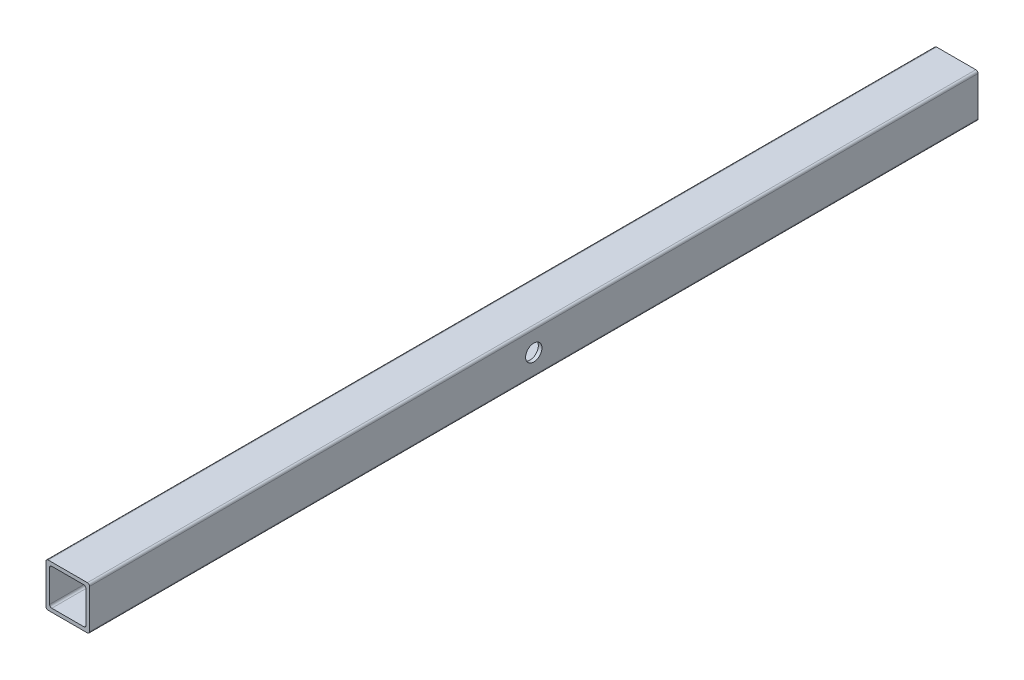
ISO-10303-21;
HEADER;
FILE_DESCRIPTION(('STEP AP214'),'2;1');
FILE_NAME('part.step','',(''),(''),'','','');
FILE_SCHEMA(('AUTOMOTIVE_DESIGN { 1 0 10303 214 1 1 1 1 }'));
ENDSEC;
DATA;
#1=APPLICATION_CONTEXT('core data for automotive mechanical design processes');
#2=APPLICATION_PROTOCOL_DEFINITION('international standard','automotive_design',2000,#1);
#3=PRODUCT_CONTEXT('',#1,'mechanical');
#4=PRODUCT('Part','Part','',(#3));
#5=PRODUCT_RELATED_PRODUCT_CATEGORY('part','',(#4));
#6=PRODUCT_DEFINITION_FORMATION('','',#4);
#7=PRODUCT_DEFINITION_CONTEXT('part definition',#1,'design');
#8=PRODUCT_DEFINITION('design','',#6,#7);
#9=PRODUCT_DEFINITION_SHAPE('','',#8);
#10=(LENGTH_UNIT() NAMED_UNIT(*) SI_UNIT(.MILLI.,.METRE.));
#11=(NAMED_UNIT(*) PLANE_ANGLE_UNIT() SI_UNIT($,.RADIAN.));
#12=(NAMED_UNIT(*) SI_UNIT($,.STERADIAN.) SOLID_ANGLE_UNIT());
#13=UNCERTAINTY_MEASURE_WITH_UNIT(LENGTH_MEASURE(1.E-05),#10,'distance_accuracy_value','');
#14=(GEOMETRIC_REPRESENTATION_CONTEXT(3) GLOBAL_UNCERTAINTY_ASSIGNED_CONTEXT((#13)) GLOBAL_UNIT_ASSIGNED_CONTEXT((#10,
#11,#12)) REPRESENTATION_CONTEXT('',''));
#15=CARTESIAN_POINT('',(0.,0.,0.));
#16=DIRECTION('',(0.,0.,1.));
#17=DIRECTION('',(1.,0.,0.));
#18=AXIS2_PLACEMENT_3D('',#15,#16,#17);
#19=CARTESIAN_POINT('',(22.0218,-0.8382,518.16));
#20=DIRECTION('',(0.,0.,1.));
#21=DIRECTION('',(1.,0.,0.));
#22=AXIS2_PLACEMENT_3D('',#19,#20,#21);
#23=PLANE('',#22);
#24=CARTESIAN_POINT('',(22.0218,-0.8382,518.16));
#25=DIRECTION('',(0.,0.,1.));
#26=DIRECTION('',(1.,0.,0.));
#27=AXIS2_PLACEMENT_3D('',#24,#25,#26);
#28=CIRCLE('',#27,1.27);
#29=CARTESIAN_POINT('',(22.0218,-2.1082,518.16));
#30=VERTEX_POINT('',#29);
#31=CARTESIAN_POINT('',(23.2918,-0.838199999999991,518.16));
#32=VERTEX_POINT('',#31);
#33=EDGE_CURVE('E222',#30,#32,#28,.T.);
#34=ORIENTED_EDGE('',*,*,#33,.T.);
#35=DIRECTION('',(0.,1.,0.));
#36=VECTOR('',#35,1.);
#37=CARTESIAN_POINT('',(23.2918,22.0218,518.16));
#38=LINE('',#37,#36);
#39=CARTESIAN_POINT('',(23.2918,22.0218,518.16));
#40=VERTEX_POINT('',#39);
#41=EDGE_CURVE('E225',#32,#40,#38,.T.);
#42=ORIENTED_EDGE('',*,*,#41,.T.);
#43=CARTESIAN_POINT('',(22.0218,22.0218,518.16));
#44=DIRECTION('',(0.,0.,1.));
#45=DIRECTION('',(-1.,0.,0.));
#46=AXIS2_PLACEMENT_3D('',#43,#44,#45);
#47=CIRCLE('',#46,1.27);
#48=CARTESIAN_POINT('',(22.0218,23.2918,518.16));
#49=VERTEX_POINT('',#48);
#50=EDGE_CURVE('E228',#40,#49,#47,.T.);
#51=ORIENTED_EDGE('',*,*,#50,.T.);
#52=DIRECTION('',(-1.,0.,0.));
#53=VECTOR('',#52,1.);
#54=CARTESIAN_POINT('',(-0.838199999999998,23.2918,518.16));
#55=LINE('',#54,#53);
#56=CARTESIAN_POINT('',(-0.838199999999997,23.2918,518.16));
#57=VERTEX_POINT('',#56);
#58=EDGE_CURVE('E230',#49,#57,#55,.T.);
#59=ORIENTED_EDGE('',*,*,#58,.T.);
#60=CARTESIAN_POINT('',(-0.838200000000007,22.0218,518.16));
#61=DIRECTION('',(0.,0.,1.));
#62=DIRECTION('',(1.,0.,0.));
#63=AXIS2_PLACEMENT_3D('',#60,#61,#62);
#64=CIRCLE('',#63,1.27);
#65=CARTESIAN_POINT('',(-2.10820000000001,22.0218,518.16));
#66=VERTEX_POINT('',#65);
#67=EDGE_CURVE('E232',#57,#66,#64,.T.);
#68=ORIENTED_EDGE('',*,*,#67,.T.);
#69=DIRECTION('',(0.,-1.,0.));
#70=VECTOR('',#69,1.);
#71=CARTESIAN_POINT('',(-2.10820000000001,22.0218,518.16));
#72=LINE('',#71,#70);
#73=CARTESIAN_POINT('',(-2.10820000000001,-0.838199999999991,518.16));
#74=VERTEX_POINT('',#73);
#75=EDGE_CURVE('E234',#66,#74,#72,.T.);
#76=ORIENTED_EDGE('',*,*,#75,.T.);
#77=CARTESIAN_POINT('',(-0.83820000000001,-0.8382,518.16));
#78=DIRECTION('',(0.,0.,1.));
#79=DIRECTION('',(1.,0.,0.));
#80=AXIS2_PLACEMENT_3D('',#77,#78,#79);
#81=CIRCLE('',#80,1.27);
#82=CARTESIAN_POINT('',(-0.838200000000001,-2.1082,518.16));
#83=VERTEX_POINT('',#82);
#84=EDGE_CURVE('E236',#74,#83,#81,.T.);
#85=ORIENTED_EDGE('',*,*,#84,.T.);
#86=DIRECTION('',(1.,0.,0.));
#87=VECTOR('',#86,1.);
#88=CARTESIAN_POINT('',(-0.838200000000001,-2.1082,518.16));
#89=LINE('',#88,#87);
#90=EDGE_CURVE('E238',#83,#30,#89,.T.);
#91=ORIENTED_EDGE('',*,*,#90,.T.);
#92=EDGE_LOOP('',(#34,#42,#51,#59,#68,#76,#85,#91));
#93=FACE_BOUND('',#92,.T.);
#94=DIRECTION('',(0.,1.,0.));
#95=VECTOR('',#94,1.);
#96=CARTESIAN_POINT('',(21.1836,1.27000000000001,518.16));
#97=LINE('',#96,#95);
#98=CARTESIAN_POINT('',(21.1836,1.27000000000001,518.16));
#99=VERTEX_POINT('',#98);
#100=CARTESIAN_POINT('',(21.1836,19.9136,518.16));
#101=VERTEX_POINT('',#100);
#102=EDGE_CURVE('E163',#99,#101,#97,.T.);
#103=ORIENTED_EDGE('',*,*,#102,.F.);
#104=CARTESIAN_POINT('',(19.9136,1.27,518.16));
#105=DIRECTION('',(0.,0.,1.));
#106=DIRECTION('',(1.,0.,0.));
#107=AXIS2_PLACEMENT_3D('',#104,#105,#106);
#108=CIRCLE('',#107,1.27);
#109=CARTESIAN_POINT('',(19.9136,0.,518.16));
#110=VERTEX_POINT('',#109);
#111=EDGE_CURVE('E155',#110,#99,#108,.T.);
#112=ORIENTED_EDGE('',*,*,#111,.F.);
#113=DIRECTION('',(1.,0.,0.));
#114=VECTOR('',#113,1.);
#115=CARTESIAN_POINT('',(1.27000000000001,0.,518.16));
#116=LINE('',#115,#114);
#117=CARTESIAN_POINT('',(1.27000000000001,0.,518.16));
#118=VERTEX_POINT('',#117);
#119=EDGE_CURVE('E189',#118,#110,#116,.T.);
#120=ORIENTED_EDGE('',*,*,#119,.F.);
#121=CARTESIAN_POINT('',(1.27,1.27,518.16));
#122=DIRECTION('',(0.,0.,1.));
#123=DIRECTION('',(-1.,0.,0.));
#124=AXIS2_PLACEMENT_3D('',#121,#122,#123);
#125=CIRCLE('',#124,1.27);
#126=CARTESIAN_POINT('',(0.,1.27,518.16));
#127=VERTEX_POINT('',#126);
#128=EDGE_CURVE('E187',#127,#118,#125,.T.);
#129=ORIENTED_EDGE('',*,*,#128,.F.);
#130=DIRECTION('',(0.,-1.,0.));
#131=VECTOR('',#130,1.);
#132=CARTESIAN_POINT('',(0.,1.27000000000001,518.16));
#133=LINE('',#132,#131);
#134=CARTESIAN_POINT('',(0.,19.9136,518.16));
#135=VERTEX_POINT('',#134);
#136=EDGE_CURVE('E185',#135,#127,#133,.T.);
#137=ORIENTED_EDGE('',*,*,#136,.F.);
#138=CARTESIAN_POINT('',(1.27,19.9136,518.16));
#139=DIRECTION('',(0.,0.,1.));
#140=DIRECTION('',(-1.,0.,0.));
#141=AXIS2_PLACEMENT_3D('',#138,#139,#140);
#142=CIRCLE('',#141,1.27);
#143=CARTESIAN_POINT('',(1.27000000000001,21.1836,518.16));
#144=VERTEX_POINT('',#143);
#145=EDGE_CURVE('E183',#144,#135,#142,.T.);
#146=ORIENTED_EDGE('',*,*,#145,.F.);
#147=DIRECTION('',(-1.,0.,0.));
#148=VECTOR('',#147,1.);
#149=CARTESIAN_POINT('',(1.27000000000001,21.1836,518.16));
#150=LINE('',#149,#148);
#151=CARTESIAN_POINT('',(19.9136,21.1836,518.16));
#152=VERTEX_POINT('',#151);
#153=EDGE_CURVE('E178',#152,#144,#150,.T.);
#154=ORIENTED_EDGE('',*,*,#153,.F.);
#155=CARTESIAN_POINT('',(19.9136,19.9136,518.16));
#156=DIRECTION('',(0.,0.,1.));
#157=DIRECTION('',(-1.,0.,0.));
#158=AXIS2_PLACEMENT_3D('',#155,#156,#157);
#159=CIRCLE('',#158,1.27);
#160=EDGE_CURVE('E176',#101,#152,#159,.T.);
#161=ORIENTED_EDGE('',*,*,#160,.F.);
#162=EDGE_LOOP('',(#103,#112,#120,#129,#137,#146,#154,#161));
#163=FACE_BOUND('',#162,.T.);
#164=ADVANCED_FACE('F41',(#93,#163),#23,.T.);
#165=CARTESIAN_POINT('',(22.0218,-0.8382,0.));
#166=DIRECTION('',(0.,0.,1.));
#167=DIRECTION('',(1.,0.,0.));
#168=AXIS2_PLACEMENT_3D('',#165,#166,#167);
#169=PLANE('',#168);
#170=CARTESIAN_POINT('',(22.0218,-0.8382,0.));
#171=DIRECTION('',(0.,0.,1.));
#172=DIRECTION('',(1.,0.,0.));
#173=AXIS2_PLACEMENT_3D('',#170,#171,#172);
#174=CIRCLE('',#173,1.27);
#175=CARTESIAN_POINT('',(22.0218,-2.1082,0.));
#176=VERTEX_POINT('',#175);
#177=CARTESIAN_POINT('',(23.2918,-0.838199999999991,0.));
#178=VERTEX_POINT('',#177);
#179=EDGE_CURVE('E171',#176,#178,#174,.T.);
#180=ORIENTED_EDGE('',*,*,#179,.F.);
#181=DIRECTION('',(1.,0.,0.));
#182=VECTOR('',#181,1.);
#183=CARTESIAN_POINT('',(-0.838200000000001,-2.1082,0.));
#184=LINE('',#183,#182);
#185=CARTESIAN_POINT('',(-0.838200000000001,-2.1082,0.));
#186=VERTEX_POINT('',#185);
#187=EDGE_CURVE('E226',#186,#176,#184,.T.);
#188=ORIENTED_EDGE('',*,*,#187,.F.);
#189=CARTESIAN_POINT('',(-0.83820000000001,-0.8382,0.));
#190=DIRECTION('',(0.,0.,1.));
#191=DIRECTION('',(1.,0.,0.));
#192=AXIS2_PLACEMENT_3D('',#189,#190,#191);
#193=CIRCLE('',#192,1.27);
#194=CARTESIAN_POINT('',(-2.10820000000001,-0.838199999999991,0.));
#195=VERTEX_POINT('',#194);
#196=EDGE_CURVE('E253',#195,#186,#193,.T.);
#197=ORIENTED_EDGE('',*,*,#196,.F.);
#198=DIRECTION('',(0.,-1.,0.));
#199=VECTOR('',#198,1.);
#200=CARTESIAN_POINT('',(-2.10820000000001,22.0218,0.));
#201=LINE('',#200,#199);
#202=CARTESIAN_POINT('',(-2.10820000000001,22.0218,0.));
#203=VERTEX_POINT('',#202);
#204=EDGE_CURVE('E251',#203,#195,#201,.T.);
#205=ORIENTED_EDGE('',*,*,#204,.F.);
#206=CARTESIAN_POINT('',(-0.838200000000007,22.0218,0.));
#207=DIRECTION('',(0.,0.,1.));
#208=DIRECTION('',(1.,0.,0.));
#209=AXIS2_PLACEMENT_3D('',#206,#207,#208);
#210=CIRCLE('',#209,1.27);
#211=CARTESIAN_POINT('',(-0.838199999999997,23.2918,0.));
#212=VERTEX_POINT('',#211);
#213=EDGE_CURVE('E249',#212,#203,#210,.T.);
#214=ORIENTED_EDGE('',*,*,#213,.F.);
#215=DIRECTION('',(-1.,0.,0.));
#216=VECTOR('',#215,1.);
#217=CARTESIAN_POINT('',(-0.838199999999998,23.2918,0.));
#218=LINE('',#217,#216);
#219=CARTESIAN_POINT('',(22.0218,23.2918,0.));
#220=VERTEX_POINT('',#219);
#221=EDGE_CURVE('E247',#220,#212,#218,.T.);
#222=ORIENTED_EDGE('',*,*,#221,.F.);
#223=CARTESIAN_POINT('',(22.0218,22.0218,0.));
#224=DIRECTION('',(0.,0.,1.));
#225=DIRECTION('',(-1.,0.,0.));
#226=AXIS2_PLACEMENT_3D('',#223,#224,#225);
#227=CIRCLE('',#226,1.27);
#228=CARTESIAN_POINT('',(23.2918,22.0218,0.));
#229=VERTEX_POINT('',#228);
#230=EDGE_CURVE('E245',#229,#220,#227,.T.);
#231=ORIENTED_EDGE('',*,*,#230,.F.);
#232=DIRECTION('',(0.,1.,0.));
#233=VECTOR('',#232,1.);
#234=CARTESIAN_POINT('',(23.2918,22.0218,0.));
#235=LINE('',#234,#233);
#236=EDGE_CURVE('E243',#178,#229,#235,.T.);
#237=ORIENTED_EDGE('',*,*,#236,.F.);
#238=EDGE_LOOP('',(#180,#188,#197,#205,#214,#222,#231,#237));
#239=FACE_BOUND('',#238,.T.);
#240=CARTESIAN_POINT('',(19.9136,1.27,0.));
#241=DIRECTION('',(0.,0.,1.));
#242=DIRECTION('',(1.,0.,0.));
#243=AXIS2_PLACEMENT_3D('',#240,#241,#242);
#244=CIRCLE('',#243,1.27);
#245=CARTESIAN_POINT('',(19.9136,0.,0.));
#246=VERTEX_POINT('',#245);
#247=CARTESIAN_POINT('',(21.1836,1.27000000000001,0.));
#248=VERTEX_POINT('',#247);
#249=EDGE_CURVE('E65',#246,#248,#244,.T.);
#250=ORIENTED_EDGE('',*,*,#249,.T.);
#251=DIRECTION('',(0.,1.,0.));
#252=VECTOR('',#251,1.);
#253=CARTESIAN_POINT('',(21.1836,1.27000000000001,0.));
#254=LINE('',#253,#252);
#255=CARTESIAN_POINT('',(21.1836,19.9136,0.));
#256=VERTEX_POINT('',#255);
#257=EDGE_CURVE('E170',#248,#256,#254,.T.);
#258=ORIENTED_EDGE('',*,*,#257,.T.);
#259=CARTESIAN_POINT('',(19.9136,19.9136,0.));
#260=DIRECTION('',(0.,0.,1.));
#261=DIRECTION('',(-1.,0.,0.));
#262=AXIS2_PLACEMENT_3D('',#259,#260,#261);
#263=CIRCLE('',#262,1.27);
#264=CARTESIAN_POINT('',(19.9136,21.1836,0.));
#265=VERTEX_POINT('',#264);
#266=EDGE_CURVE('E194',#256,#265,#263,.T.);
#267=ORIENTED_EDGE('',*,*,#266,.T.);
#268=DIRECTION('',(-1.,0.,0.));
#269=VECTOR('',#268,1.);
#270=CARTESIAN_POINT('',(1.27000000000001,21.1836,0.));
#271=LINE('',#270,#269);
#272=CARTESIAN_POINT('',(1.27000000000001,21.1836,0.));
#273=VERTEX_POINT('',#272);
#274=EDGE_CURVE('E197',#265,#273,#271,.T.);
#275=ORIENTED_EDGE('',*,*,#274,.T.);
#276=CARTESIAN_POINT('',(1.27,19.9136,0.));
#277=DIRECTION('',(0.,0.,1.));
#278=DIRECTION('',(-1.,0.,0.));
#279=AXIS2_PLACEMENT_3D('',#276,#277,#278);
#280=CIRCLE('',#279,1.27);
#281=CARTESIAN_POINT('',(0.,19.9136,0.));
#282=VERTEX_POINT('',#281);
#283=EDGE_CURVE('E200',#273,#282,#280,.T.);
#284=ORIENTED_EDGE('',*,*,#283,.T.);
#285=DIRECTION('',(0.,-1.,0.));
#286=VECTOR('',#285,1.);
#287=CARTESIAN_POINT('',(0.,1.27000000000001,0.));
#288=LINE('',#287,#286);
#289=CARTESIAN_POINT('',(0.,1.27,0.));
#290=VERTEX_POINT('',#289);
#291=EDGE_CURVE('E203',#282,#290,#288,.T.);
#292=ORIENTED_EDGE('',*,*,#291,.T.);
#293=CARTESIAN_POINT('',(1.27,1.27,0.));
#294=DIRECTION('',(0.,0.,1.));
#295=DIRECTION('',(-1.,0.,0.));
#296=AXIS2_PLACEMENT_3D('',#293,#294,#295);
#297=CIRCLE('',#296,1.27);
#298=CARTESIAN_POINT('',(1.27000000000001,0.,0.));
#299=VERTEX_POINT('',#298);
#300=EDGE_CURVE('E206',#290,#299,#297,.T.);
#301=ORIENTED_EDGE('',*,*,#300,.T.);
#302=DIRECTION('',(1.,0.,0.));
#303=VECTOR('',#302,1.);
#304=CARTESIAN_POINT('',(1.27000000000001,0.,0.));
#305=LINE('',#304,#303);
#306=EDGE_CURVE('E164',#299,#246,#305,.T.);
#307=ORIENTED_EDGE('',*,*,#306,.T.);
#308=EDGE_LOOP('',(#250,#258,#267,#275,#284,#292,#301,#307));
#309=FACE_BOUND('',#308,.T.);
#310=ADVANCED_FACE('F284',(#239,#309),#169,.F.);
#311=CARTESIAN_POINT('',(22.0218,-0.8382,518.16));
#312=DIRECTION('',(0.,0.,-1.));
#313=DIRECTION('',(-1.,0.,0.));
#314=AXIS2_PLACEMENT_3D('',#311,#312,#313);
#315=CYLINDRICAL_SURFACE('',#314,1.27);
#316=ORIENTED_EDGE('',*,*,#179,.T.);
#317=DIRECTION('',(0.,0.,-1.));
#318=VECTOR('',#317,1.);
#319=CARTESIAN_POINT('',(23.2918,-0.838199999999991,518.16));
#320=LINE('',#319,#318);
#321=EDGE_CURVE('E11',#32,#178,#320,.T.);
#322=ORIENTED_EDGE('',*,*,#321,.F.);
#323=ORIENTED_EDGE('',*,*,#33,.F.);
#324=DIRECTION('',(0.,0.,-1.));
#325=VECTOR('',#324,1.);
#326=CARTESIAN_POINT('',(22.0218,-2.1082,518.16));
#327=LINE('',#326,#325);
#328=EDGE_CURVE('E240',#30,#176,#327,.T.);
#329=ORIENTED_EDGE('',*,*,#328,.T.);
#330=EDGE_LOOP('',(#316,#322,#323,#329));
#331=FACE_BOUND('',#330,.T.);
#332=ADVANCED_FACE('F43',(#331),#315,.T.);
#333=CARTESIAN_POINT('',(23.2918,22.0218,518.16));
#334=DIRECTION('',(-1.,0.,0.));
#335=DIRECTION('',(0.,-1.,0.));
#336=AXIS2_PLACEMENT_3D('',#333,#334,#335);
#337=PLANE('',#336);
#338=CARTESIAN_POINT('',(23.2918,10.5918,259.08));
#339=DIRECTION('',(-1.,0.,0.));
#340=DIRECTION('',(0.,-1.,0.));
#341=AXIS2_PLACEMENT_3D('',#338,#339,#340);
#342=CIRCLE('',#341,4.76250000000001);
#343=CARTESIAN_POINT('',(23.2918,5.82929999999998,259.08));
#344=VERTEX_POINT('',#343);
#345=EDGE_CURVE('E382',#344,#344,#342,.T.);
#346=ORIENTED_EDGE('',*,*,#345,.T.);
#347=EDGE_LOOP('',(#346));
#348=FACE_BOUND('',#347,.T.);
#349=ORIENTED_EDGE('',*,*,#236,.T.);
#350=DIRECTION('',(0.,0.,-1.));
#351=VECTOR('',#350,1.);
#352=CARTESIAN_POINT('',(23.2918,22.0218,518.16));
#353=LINE('',#352,#351);
#354=EDGE_CURVE('E50',#40,#229,#353,.T.);
#355=ORIENTED_EDGE('',*,*,#354,.F.);
#356=ORIENTED_EDGE('',*,*,#41,.F.);
#357=ORIENTED_EDGE('',*,*,#321,.T.);
#358=EDGE_LOOP('',(#349,#355,#356,#357));
#359=FACE_BOUND('',#358,.T.);
#360=ADVANCED_FACE('F301',(#348,#359),#337,.F.);
#361=CARTESIAN_POINT('',(22.0218,22.0218,518.16));
#362=DIRECTION('',(0.,0.,-1.));
#363=DIRECTION('',(-1.,0.,0.));
#364=AXIS2_PLACEMENT_3D('',#361,#362,#363);
#365=CYLINDRICAL_SURFACE('',#364,1.27);
#366=ORIENTED_EDGE('',*,*,#230,.T.);
#367=DIRECTION('',(0.,0.,-1.));
#368=VECTOR('',#367,1.);
#369=CARTESIAN_POINT('',(22.0218,23.2918,518.16));
#370=LINE('',#369,#368);
#371=EDGE_CURVE('E270',#49,#220,#370,.T.);
#372=ORIENTED_EDGE('',*,*,#371,.F.);
#373=ORIENTED_EDGE('',*,*,#50,.F.);
#374=ORIENTED_EDGE('',*,*,#354,.T.);
#375=EDGE_LOOP('',(#366,#372,#373,#374));
#376=FACE_BOUND('',#375,.T.);
#377=ADVANCED_FACE('F278',(#376),#365,.T.);
#378=CARTESIAN_POINT('',(-0.838199999999998,23.2918,518.16));
#379=DIRECTION('',(0.,-1.,0.));
#380=DIRECTION('',(1.,0.,0.));
#381=AXIS2_PLACEMENT_3D('',#378,#379,#380);
#382=PLANE('',#381);
#383=ORIENTED_EDGE('',*,*,#221,.T.);
#384=DIRECTION('',(0.,0.,-1.));
#385=VECTOR('',#384,1.);
#386=CARTESIAN_POINT('',(-0.838199999999997,23.2918,518.16));
#387=LINE('',#386,#385);
#388=EDGE_CURVE('E267',#57,#212,#387,.T.);
#389=ORIENTED_EDGE('',*,*,#388,.F.);
#390=ORIENTED_EDGE('',*,*,#58,.F.);
#391=ORIENTED_EDGE('',*,*,#371,.T.);
#392=EDGE_LOOP('',(#383,#389,#390,#391));
#393=FACE_BOUND('',#392,.T.);
#394=ADVANCED_FACE('F290',(#393),#382,.F.);
#395=CARTESIAN_POINT('',(-0.838200000000007,22.0218,518.16));
#396=DIRECTION('',(0.,0.,-1.));
#397=DIRECTION('',(-1.,0.,0.));
#398=AXIS2_PLACEMENT_3D('',#395,#396,#397);
#399=CYLINDRICAL_SURFACE('',#398,1.27);
#400=ORIENTED_EDGE('',*,*,#213,.T.);
#401=DIRECTION('',(0.,0.,-1.));
#402=VECTOR('',#401,1.);
#403=CARTESIAN_POINT('',(-2.10820000000001,22.0218,518.16));
#404=LINE('',#403,#402);
#405=EDGE_CURVE('E264',#66,#203,#404,.T.);
#406=ORIENTED_EDGE('',*,*,#405,.F.);
#407=ORIENTED_EDGE('',*,*,#67,.F.);
#408=ORIENTED_EDGE('',*,*,#388,.T.);
#409=EDGE_LOOP('',(#400,#406,#407,#408));
#410=FACE_BOUND('',#409,.T.);
#411=ADVANCED_FACE('F294',(#410),#399,.T.);
#412=CARTESIAN_POINT('',(-2.10820000000001,22.0218,518.16));
#413=DIRECTION('',(1.,0.,0.));
#414=DIRECTION('',(0.,1.,0.));
#415=AXIS2_PLACEMENT_3D('',#412,#413,#414);
#416=PLANE('',#415);
#417=CARTESIAN_POINT('',(-2.10820000000001,10.5918,259.08));
#418=DIRECTION('',(-1.,0.,0.));
#419=DIRECTION('',(0.,-1.,0.));
#420=AXIS2_PLACEMENT_3D('',#417,#418,#419);
#421=CIRCLE('',#420,4.76250000000001);
#422=CARTESIAN_POINT('',(-2.10820000000001,5.82929999999999,259.08));
#423=VERTEX_POINT('',#422);
#424=EDGE_CURVE('E381',#423,#423,#421,.T.);
#425=ORIENTED_EDGE('',*,*,#424,.F.);
#426=EDGE_LOOP('',(#425));
#427=FACE_BOUND('',#426,.T.);
#428=ORIENTED_EDGE('',*,*,#204,.T.);
#429=DIRECTION('',(0.,0.,-1.));
#430=VECTOR('',#429,1.);
#431=CARTESIAN_POINT('',(-2.10820000000001,-0.838199999999991,518.16));
#432=LINE('',#431,#430);
#433=EDGE_CURVE('E261',#74,#195,#432,.T.);
#434=ORIENTED_EDGE('',*,*,#433,.F.);
#435=ORIENTED_EDGE('',*,*,#75,.F.);
#436=ORIENTED_EDGE('',*,*,#405,.T.);
#437=EDGE_LOOP('',(#428,#434,#435,#436));
#438=FACE_BOUND('',#437,.T.);
#439=ADVANCED_FACE('F314',(#427,#438),#416,.F.);
#440=CARTESIAN_POINT('',(-0.83820000000001,-0.8382,518.16));
#441=DIRECTION('',(0.,0.,-1.));
#442=DIRECTION('',(-1.,0.,0.));
#443=AXIS2_PLACEMENT_3D('',#440,#441,#442);
#444=CYLINDRICAL_SURFACE('',#443,1.27);
#445=ORIENTED_EDGE('',*,*,#196,.T.);
#446=DIRECTION('',(0.,0.,-1.));
#447=VECTOR('',#446,1.);
#448=CARTESIAN_POINT('',(-0.838200000000001,-2.1082,518.16));
#449=LINE('',#448,#447);
#450=EDGE_CURVE('E258',#83,#186,#449,.T.);
#451=ORIENTED_EDGE('',*,*,#450,.F.);
#452=ORIENTED_EDGE('',*,*,#84,.F.);
#453=ORIENTED_EDGE('',*,*,#433,.T.);
#454=EDGE_LOOP('',(#445,#451,#452,#453));
#455=FACE_BOUND('',#454,.T.);
#456=ADVANCED_FACE('F312',(#455),#444,.T.);
#457=CARTESIAN_POINT('',(-0.838200000000001,-2.1082,518.16));
#458=DIRECTION('',(0.,1.,0.));
#459=DIRECTION('',(0.,0.,1.));
#460=AXIS2_PLACEMENT_3D('',#457,#458,#459);
#461=PLANE('',#460);
#462=ORIENTED_EDGE('',*,*,#187,.T.);
#463=ORIENTED_EDGE('',*,*,#328,.F.);
#464=ORIENTED_EDGE('',*,*,#90,.F.);
#465=ORIENTED_EDGE('',*,*,#450,.T.);
#466=EDGE_LOOP('',(#462,#463,#464,#465));
#467=FACE_BOUND('',#466,.T.);
#468=ADVANCED_FACE('F307',(#467),#461,.F.);
#469=CARTESIAN_POINT('',(19.9136,1.27,518.16));
#470=DIRECTION('',(0.,0.,-1.));
#471=DIRECTION('',(-1.,0.,0.));
#472=AXIS2_PLACEMENT_3D('',#469,#470,#471);
#473=CYLINDRICAL_SURFACE('',#472,1.27);
#474=ORIENTED_EDGE('',*,*,#249,.F.);
#475=DIRECTION('',(0.,0.,-1.));
#476=VECTOR('',#475,1.);
#477=CARTESIAN_POINT('',(19.9136,0.,518.16));
#478=LINE('',#477,#476);
#479=EDGE_CURVE('E159',#110,#246,#478,.T.);
#480=ORIENTED_EDGE('',*,*,#479,.F.);
#481=ORIENTED_EDGE('',*,*,#111,.T.);
#482=DIRECTION('',(0.,0.,-1.));
#483=VECTOR('',#482,1.);
#484=CARTESIAN_POINT('',(21.1836,1.27000000000001,518.16));
#485=LINE('',#484,#483);
#486=EDGE_CURVE('E158',#99,#248,#485,.T.);
#487=ORIENTED_EDGE('',*,*,#486,.T.);
#488=EDGE_LOOP('',(#474,#480,#481,#487));
#489=FACE_BOUND('',#488,.T.);
#490=ADVANCED_FACE('F157',(#489),#473,.F.);
#491=CARTESIAN_POINT('',(21.1836,1.27000000000001,518.16));
#492=DIRECTION('',(-1.,0.,0.));
#493=DIRECTION('',(0.,0.,1.));
#494=AXIS2_PLACEMENT_3D('',#491,#492,#493);
#495=PLANE('',#494);
#496=CARTESIAN_POINT('',(21.1836,10.5918,259.08));
#497=DIRECTION('',(-1.,0.,0.));
#498=DIRECTION('',(0.,0.,1.));
#499=AXIS2_PLACEMENT_3D('',#496,#497,#498);
#500=CIRCLE('',#499,4.76250000000001);
#501=CARTESIAN_POINT('',(21.1836,10.5918,263.8425));
#502=VERTEX_POINT('',#501);
#503=EDGE_CURVE('E192',#502,#502,#500,.T.);
#504=ORIENTED_EDGE('',*,*,#503,.F.);
#505=EDGE_LOOP('',(#504));
#506=FACE_BOUND('',#505,.T.);
#507=ORIENTED_EDGE('',*,*,#257,.F.);
#508=ORIENTED_EDGE('',*,*,#486,.F.);
#509=ORIENTED_EDGE('',*,*,#102,.T.);
#510=DIRECTION('',(0.,0.,-1.));
#511=VECTOR('',#510,1.);
#512=CARTESIAN_POINT('',(21.1836,19.9136,518.16));
#513=LINE('',#512,#511);
#514=EDGE_CURVE('E172',#101,#256,#513,.T.);
#515=ORIENTED_EDGE('',*,*,#514,.T.);
#516=EDGE_LOOP('',(#507,#508,#509,#515));
#517=FACE_BOUND('',#516,.T.);
#518=ADVANCED_FACE('F167',(#506,#517),#495,.T.);
#519=CARTESIAN_POINT('',(19.9136,19.9136,518.16));
#520=DIRECTION('',(0.,0.,-1.));
#521=DIRECTION('',(-1.,0.,0.));
#522=AXIS2_PLACEMENT_3D('',#519,#520,#521);
#523=CYLINDRICAL_SURFACE('',#522,1.27);
#524=ORIENTED_EDGE('',*,*,#266,.F.);
#525=ORIENTED_EDGE('',*,*,#514,.F.);
#526=ORIENTED_EDGE('',*,*,#160,.T.);
#527=DIRECTION('',(0.,0.,-1.));
#528=VECTOR('',#527,1.);
#529=CARTESIAN_POINT('',(19.9136,21.1836,518.16));
#530=LINE('',#529,#528);
#531=EDGE_CURVE('E219',#152,#265,#530,.T.);
#532=ORIENTED_EDGE('',*,*,#531,.T.);
#533=EDGE_LOOP('',(#524,#525,#526,#532));
#534=FACE_BOUND('',#533,.T.);
#535=ADVANCED_FACE('F341',(#534),#523,.F.);
#536=CARTESIAN_POINT('',(1.27000000000001,21.1836,518.16));
#537=DIRECTION('',(0.,-1.,0.));
#538=DIRECTION('',(0.,0.,-1.));
#539=AXIS2_PLACEMENT_3D('',#536,#537,#538);
#540=PLANE('',#539);
#541=ORIENTED_EDGE('',*,*,#274,.F.);
#542=ORIENTED_EDGE('',*,*,#531,.F.);
#543=ORIENTED_EDGE('',*,*,#153,.T.);
#544=DIRECTION('',(0.,0.,-1.));
#545=VECTOR('',#544,1.);
#546=CARTESIAN_POINT('',(1.27000000000001,21.1836,518.16));
#547=LINE('',#546,#545);
#548=EDGE_CURVE('E217',#144,#273,#547,.T.);
#549=ORIENTED_EDGE('',*,*,#548,.T.);
#550=EDGE_LOOP('',(#541,#542,#543,#549));
#551=FACE_BOUND('',#550,.T.);
#552=ADVANCED_FACE('F346',(#551),#540,.T.);
#553=CARTESIAN_POINT('',(1.27,19.9136,518.16));
#554=DIRECTION('',(0.,0.,-1.));
#555=DIRECTION('',(-1.,0.,0.));
#556=AXIS2_PLACEMENT_3D('',#553,#554,#555);
#557=CYLINDRICAL_SURFACE('',#556,1.27);
#558=ORIENTED_EDGE('',*,*,#283,.F.);
#559=ORIENTED_EDGE('',*,*,#548,.F.);
#560=ORIENTED_EDGE('',*,*,#145,.T.);
#561=DIRECTION('',(0.,0.,-1.));
#562=VECTOR('',#561,1.);
#563=CARTESIAN_POINT('',(0.,19.9136,518.16));
#564=LINE('',#563,#562);
#565=EDGE_CURVE('E215',#135,#282,#564,.T.);
#566=ORIENTED_EDGE('',*,*,#565,.T.);
#567=EDGE_LOOP('',(#558,#559,#560,#566));
#568=FACE_BOUND('',#567,.T.);
#569=ADVANCED_FACE('F353',(#568),#557,.F.);
#570=CARTESIAN_POINT('',(0.,1.27000000000001,518.16));
#571=DIRECTION('',(1.,0.,0.));
#572=DIRECTION('',(0.,0.,-1.));
#573=AXIS2_PLACEMENT_3D('',#570,#571,#572);
#574=PLANE('',#573);
#575=CARTESIAN_POINT('',(0.,10.5918,259.08));
#576=DIRECTION('',(1.,0.,0.));
#577=DIRECTION('',(0.,0.,-1.));
#578=AXIS2_PLACEMENT_3D('',#575,#576,#577);
#579=CIRCLE('',#578,4.76250000000001);
#580=CARTESIAN_POINT('',(0.,10.5918,254.3175));
#581=VERTEX_POINT('',#580);
#582=EDGE_CURVE('E45',#581,#581,#579,.T.);
#583=ORIENTED_EDGE('',*,*,#582,.F.);
#584=EDGE_LOOP('',(#583));
#585=FACE_BOUND('',#584,.T.);
#586=ORIENTED_EDGE('',*,*,#291,.F.);
#587=ORIENTED_EDGE('',*,*,#565,.F.);
#588=ORIENTED_EDGE('',*,*,#136,.T.);
#589=DIRECTION('',(0.,0.,-1.));
#590=VECTOR('',#589,1.);
#591=CARTESIAN_POINT('',(0.,1.27,518.16));
#592=LINE('',#591,#590);
#593=EDGE_CURVE('E213',#127,#290,#592,.T.);
#594=ORIENTED_EDGE('',*,*,#593,.T.);
#595=EDGE_LOOP('',(#586,#587,#588,#594));
#596=FACE_BOUND('',#595,.T.);
#597=ADVANCED_FACE('F357',(#585,#596),#574,.T.);
#598=CARTESIAN_POINT('',(1.27,1.27,518.16));
#599=DIRECTION('',(0.,0.,-1.));
#600=DIRECTION('',(-1.,0.,0.));
#601=AXIS2_PLACEMENT_3D('',#598,#599,#600);
#602=CYLINDRICAL_SURFACE('',#601,1.27);
#603=ORIENTED_EDGE('',*,*,#300,.F.);
#604=ORIENTED_EDGE('',*,*,#593,.F.);
#605=ORIENTED_EDGE('',*,*,#128,.T.);
#606=DIRECTION('',(0.,0.,-1.));
#607=VECTOR('',#606,1.);
#608=CARTESIAN_POINT('',(1.27000000000001,0.,518.16));
#609=LINE('',#608,#607);
#610=EDGE_CURVE('E57',#118,#299,#609,.T.);
#611=ORIENTED_EDGE('',*,*,#610,.T.);
#612=EDGE_LOOP('',(#603,#604,#605,#611));
#613=FACE_BOUND('',#612,.T.);
#614=ADVANCED_FACE('F361',(#613),#602,.F.);
#615=CARTESIAN_POINT('',(1.27000000000001,0.,518.16));
#616=DIRECTION('',(0.,1.,0.));
#617=DIRECTION('',(0.,0.,1.));
#618=AXIS2_PLACEMENT_3D('',#615,#616,#617);
#619=PLANE('',#618);
#620=ORIENTED_EDGE('',*,*,#306,.F.);
#621=ORIENTED_EDGE('',*,*,#610,.F.);
#622=ORIENTED_EDGE('',*,*,#119,.T.);
#623=ORIENTED_EDGE('',*,*,#479,.T.);
#624=EDGE_LOOP('',(#620,#621,#622,#623));
#625=FACE_BOUND('',#624,.T.);
#626=ADVANCED_FACE('F365',(#625),#619,.T.);
#627=CARTESIAN_POINT('',(23.2918,10.5918,259.08));
#628=DIRECTION('',(-1.,0.,0.));
#629=DIRECTION('',(0.,-1.,0.));
#630=AXIS2_PLACEMENT_3D('',#627,#628,#629);
#631=CYLINDRICAL_SURFACE('',#630,4.76250000000001);
#632=ORIENTED_EDGE('',*,*,#582,.T.);
#633=EDGE_LOOP('',(#632));
#634=FACE_BOUND('',#633,.T.);
#635=ORIENTED_EDGE('',*,*,#424,.T.);
#636=EDGE_LOOP('',(#635));
#637=FACE_BOUND('',#636,.T.);
#638=ADVANCED_FACE('F369',(#634,#637),#631,.F.);
#639=ORIENTED_EDGE('',*,*,#503,.T.);
#640=EDGE_LOOP('',(#639));
#641=FACE_BOUND('',#640,.T.);
#642=ORIENTED_EDGE('',*,*,#345,.F.);
#643=EDGE_LOOP('',(#642));
#644=FACE_BOUND('',#643,.T.);
#645=ADVANCED_FACE('F371',(#641,#644),#631,.F.);
#646=CLOSED_SHELL('',(#164,#310,#332,#360,#377,#394,#411,#439,#456,#468,#490,#518,#535,#552,
#569,#597,#614,#626,#638,#645));
#647=MANIFOLD_SOLID_BREP('B2',#646);
#648=ADVANCED_BREP_SHAPE_REPRESENTATION('',(#18,#647),#14);
#649=SHAPE_DEFINITION_REPRESENTATION(#9,#648);
ENDSEC;
END-ISO-10303-21;
